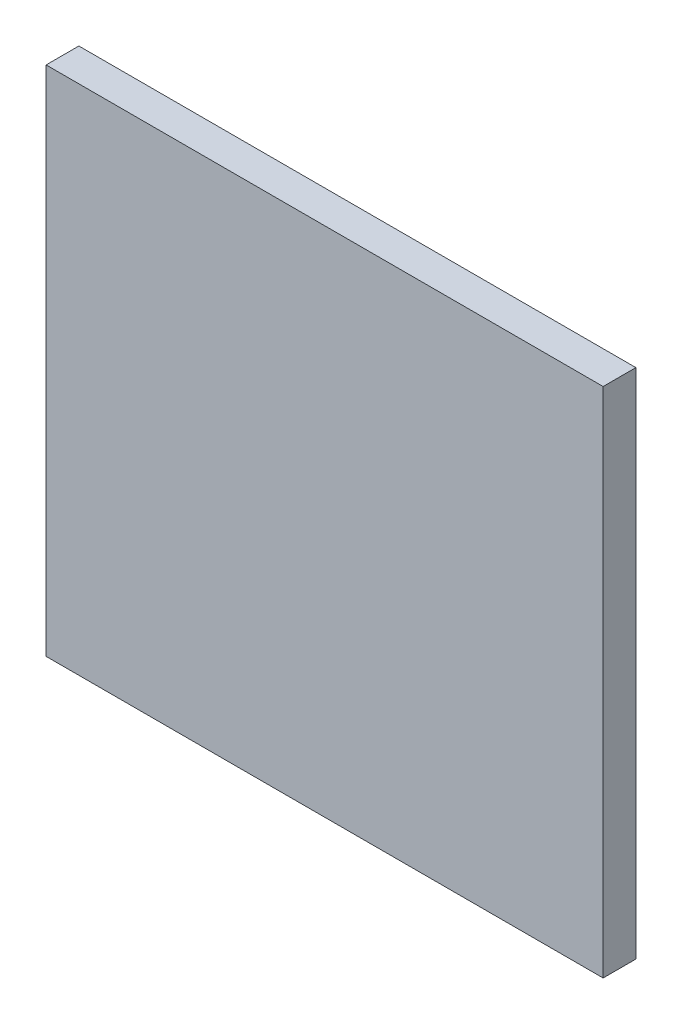
ISO-10303-21;
HEADER;
FILE_DESCRIPTION(('STEP AP214'),'2;1');
FILE_NAME('part.step','',(''),(''),'','','');
FILE_SCHEMA(('AUTOMOTIVE_DESIGN { 1 0 10303 214 1 1 1 1 }'));
ENDSEC;
DATA;
#1=APPLICATION_CONTEXT('core data for automotive mechanical design processes');
#2=APPLICATION_PROTOCOL_DEFINITION('international standard','automotive_design',2000,#1);
#3=PRODUCT_CONTEXT('',#1,'mechanical');
#4=PRODUCT('Part','Part','',(#3));
#5=PRODUCT_RELATED_PRODUCT_CATEGORY('part','',(#4));
#6=PRODUCT_DEFINITION_FORMATION('','',#4);
#7=PRODUCT_DEFINITION_CONTEXT('part definition',#1,'design');
#8=PRODUCT_DEFINITION('design','',#6,#7);
#9=PRODUCT_DEFINITION_SHAPE('','',#8);
#10=(LENGTH_UNIT() NAMED_UNIT(*) SI_UNIT(.MILLI.,.METRE.));
#11=(NAMED_UNIT(*) PLANE_ANGLE_UNIT() SI_UNIT($,.RADIAN.));
#12=(NAMED_UNIT(*) SI_UNIT($,.STERADIAN.) SOLID_ANGLE_UNIT());
#13=UNCERTAINTY_MEASURE_WITH_UNIT(LENGTH_MEASURE(1.E-05),#10,'distance_accuracy_value','');
#14=(GEOMETRIC_REPRESENTATION_CONTEXT(3) GLOBAL_UNCERTAINTY_ASSIGNED_CONTEXT((#13)) GLOBAL_UNIT_ASSIGNED_CONTEXT((#10,
#11,#12)) REPRESENTATION_CONTEXT('',''));
#15=CARTESIAN_POINT('',(0.,0.,0.));
#16=DIRECTION('',(0.,0.,1.));
#17=DIRECTION('',(1.,0.,0.));
#18=AXIS2_PLACEMENT_3D('',#15,#16,#17);
#19=CARTESIAN_POINT('',(-0.555,0.353335,1.1));
#20=DIRECTION('',(0.,0.,1.));
#21=DIRECTION('',(1.,0.,0.));
#22=AXIS2_PLACEMENT_3D('',#19,#20,#21);
#23=PLANE('',#22);
#24=DIRECTION('',(1.,0.,0.));
#25=VECTOR('',#24,1.);
#26=CARTESIAN_POINT('',(-9.91,-8.25,1.1));
#27=LINE('',#26,#25);
#28=CARTESIAN_POINT('',(-9.91,-8.25,1.1));
#29=VERTEX_POINT('',#28);
#30=CARTESIAN_POINT('',(8.8,-8.25,1.1));
#31=VERTEX_POINT('',#30);
#32=EDGE_CURVE('E20',#29,#31,#27,.T.);
#33=ORIENTED_EDGE('',*,*,#32,.T.);
#34=DIRECTION('',(0.,1.,0.));
#35=VECTOR('',#34,1.);
#36=CARTESIAN_POINT('',(8.8,-8.25,1.1));
#37=LINE('',#36,#35);
#38=CARTESIAN_POINT('',(8.8,8.95667,1.1));
#39=VERTEX_POINT('',#38);
#40=EDGE_CURVE('E78',#31,#39,#37,.T.);
#41=ORIENTED_EDGE('',*,*,#40,.T.);
#42=DIRECTION('',(-1.,0.,0.));
#43=VECTOR('',#42,1.);
#44=CARTESIAN_POINT('',(8.8,8.95667,1.1));
#45=LINE('',#44,#43);
#46=CARTESIAN_POINT('',(-9.91,8.95667,1.1));
#47=VERTEX_POINT('',#46);
#48=EDGE_CURVE('E106',#39,#47,#45,.T.);
#49=ORIENTED_EDGE('',*,*,#48,.T.);
#50=DIRECTION('',(0.,-1.,0.));
#51=VECTOR('',#50,1.);
#52=CARTESIAN_POINT('',(-9.91,8.95667,1.1));
#53=LINE('',#52,#51);
#54=EDGE_CURVE('E11',#47,#29,#53,.T.);
#55=ORIENTED_EDGE('',*,*,#54,.T.);
#56=EDGE_LOOP('',(#33,#41,#49,#55));
#57=FACE_BOUND('',#56,.T.);
#58=ADVANCED_FACE('F16',(#57),#23,.T.);
#59=CARTESIAN_POINT('',(-0.555,0.353335,0.));
#60=DIRECTION('',(0.,0.,1.));
#61=DIRECTION('',(1.,0.,0.));
#62=AXIS2_PLACEMENT_3D('',#59,#60,#61);
#63=PLANE('',#62);
#64=DIRECTION('',(1.,0.,0.));
#65=VECTOR('',#64,1.);
#66=CARTESIAN_POINT('',(-9.91,-8.25,0.));
#67=LINE('',#66,#65);
#68=CARTESIAN_POINT('',(-9.91,-8.25,0.));
#69=VERTEX_POINT('',#68);
#70=CARTESIAN_POINT('',(8.8,-8.25,0.));
#71=VERTEX_POINT('',#70);
#72=EDGE_CURVE('E92',#69,#71,#67,.T.);
#73=ORIENTED_EDGE('',*,*,#72,.F.);
#74=DIRECTION('',(0.,-1.,0.));
#75=VECTOR('',#74,1.);
#76=CARTESIAN_POINT('',(-9.91,8.95667,0.));
#77=LINE('',#76,#75);
#78=CARTESIAN_POINT('',(-9.91,8.95667,0.));
#79=VERTEX_POINT('',#78);
#80=EDGE_CURVE('E27',#79,#69,#77,.T.);
#81=ORIENTED_EDGE('',*,*,#80,.F.);
#82=DIRECTION('',(-1.,0.,0.));
#83=VECTOR('',#82,1.);
#84=CARTESIAN_POINT('',(8.8,8.95667,0.));
#85=LINE('',#84,#83);
#86=CARTESIAN_POINT('',(8.8,8.95667,0.));
#87=VERTEX_POINT('',#86);
#88=EDGE_CURVE('E67',#87,#79,#85,.T.);
#89=ORIENTED_EDGE('',*,*,#88,.F.);
#90=DIRECTION('',(0.,1.,0.));
#91=VECTOR('',#90,1.);
#92=CARTESIAN_POINT('',(8.8,-8.25,0.));
#93=LINE('',#92,#91);
#94=EDGE_CURVE('E90',#71,#87,#93,.T.);
#95=ORIENTED_EDGE('',*,*,#94,.F.);
#96=EDGE_LOOP('',(#73,#81,#89,#95));
#97=FACE_BOUND('',#96,.T.);
#98=ADVANCED_FACE('F117',(#97),#63,.F.);
#99=CARTESIAN_POINT('',(-9.91,8.95667,0.));
#100=DIRECTION('',(1.,0.,0.));
#101=DIRECTION('',(0.,1.,0.));
#102=AXIS2_PLACEMENT_3D('',#99,#100,#101);
#103=PLANE('',#102);
#104=DIRECTION('',(0.,0.,1.));
#105=VECTOR('',#104,1.);
#106=CARTESIAN_POINT('',(-9.91,8.95667,0.));
#107=LINE('',#106,#105);
#108=EDGE_CURVE('E102',#79,#47,#107,.T.);
#109=ORIENTED_EDGE('',*,*,#108,.F.);
#110=ORIENTED_EDGE('',*,*,#80,.T.);
#111=DIRECTION('',(0.,0.,1.));
#112=VECTOR('',#111,1.);
#113=CARTESIAN_POINT('',(-9.91,-8.25,0.));
#114=LINE('',#113,#112);
#115=EDGE_CURVE('E98',#69,#29,#114,.T.);
#116=ORIENTED_EDGE('',*,*,#115,.T.);
#117=ORIENTED_EDGE('',*,*,#54,.F.);
#118=EDGE_LOOP('',(#109,#110,#116,#117));
#119=FACE_BOUND('',#118,.T.);
#120=ADVANCED_FACE('F118',(#119),#103,.F.);
#121=CARTESIAN_POINT('',(8.8,8.95667,0.));
#122=DIRECTION('',(0.,-1.,0.));
#123=DIRECTION('',(0.,0.,-1.));
#124=AXIS2_PLACEMENT_3D('',#121,#122,#123);
#125=PLANE('',#124);
#126=DIRECTION('',(0.,0.,1.));
#127=VECTOR('',#126,1.);
#128=CARTESIAN_POINT('',(8.8,8.95667,0.));
#129=LINE('',#128,#127);
#130=EDGE_CURVE('E84',#87,#39,#129,.T.);
#131=ORIENTED_EDGE('',*,*,#130,.F.);
#132=ORIENTED_EDGE('',*,*,#88,.T.);
#133=ORIENTED_EDGE('',*,*,#108,.T.);
#134=ORIENTED_EDGE('',*,*,#48,.F.);
#135=EDGE_LOOP('',(#131,#132,#133,#134));
#136=FACE_BOUND('',#135,.T.);
#137=ADVANCED_FACE('F18',(#136),#125,.F.);
#138=CARTESIAN_POINT('',(8.8,-8.25,0.));
#139=DIRECTION('',(-1.,0.,0.));
#140=DIRECTION('',(0.,0.,1.));
#141=AXIS2_PLACEMENT_3D('',#138,#139,#140);
#142=PLANE('',#141);
#143=DIRECTION('',(0.,0.,1.));
#144=VECTOR('',#143,1.);
#145=CARTESIAN_POINT('',(8.8,-8.25,0.));
#146=LINE('',#145,#144);
#147=EDGE_CURVE('E82',#71,#31,#146,.T.);
#148=ORIENTED_EDGE('',*,*,#147,.F.);
#149=ORIENTED_EDGE('',*,*,#94,.T.);
#150=ORIENTED_EDGE('',*,*,#130,.T.);
#151=ORIENTED_EDGE('',*,*,#40,.F.);
#152=EDGE_LOOP('',(#148,#149,#150,#151));
#153=FACE_BOUND('',#152,.T.);
#154=ADVANCED_FACE('F79',(#153),#142,.F.);
#155=CARTESIAN_POINT('',(-9.91,-8.25,0.));
#156=DIRECTION('',(0.,1.,0.));
#157=DIRECTION('',(1.,0.,0.));
#158=AXIS2_PLACEMENT_3D('',#155,#156,#157);
#159=PLANE('',#158);
#160=ORIENTED_EDGE('',*,*,#115,.F.);
#161=ORIENTED_EDGE('',*,*,#72,.T.);
#162=ORIENTED_EDGE('',*,*,#147,.T.);
#163=ORIENTED_EDGE('',*,*,#32,.F.);
#164=EDGE_LOOP('',(#160,#161,#162,#163));
#165=FACE_BOUND('',#164,.T.);
#166=ADVANCED_FACE('F91',(#165),#159,.F.);
#167=CLOSED_SHELL('',(#58,#98,#120,#137,#154,#166));
#168=MANIFOLD_SOLID_BREP('B1',#167);
#169=ADVANCED_BREP_SHAPE_REPRESENTATION('',(#18,#168),#14);
#170=SHAPE_DEFINITION_REPRESENTATION(#9,#169);
ENDSEC;
END-ISO-10303-21;
